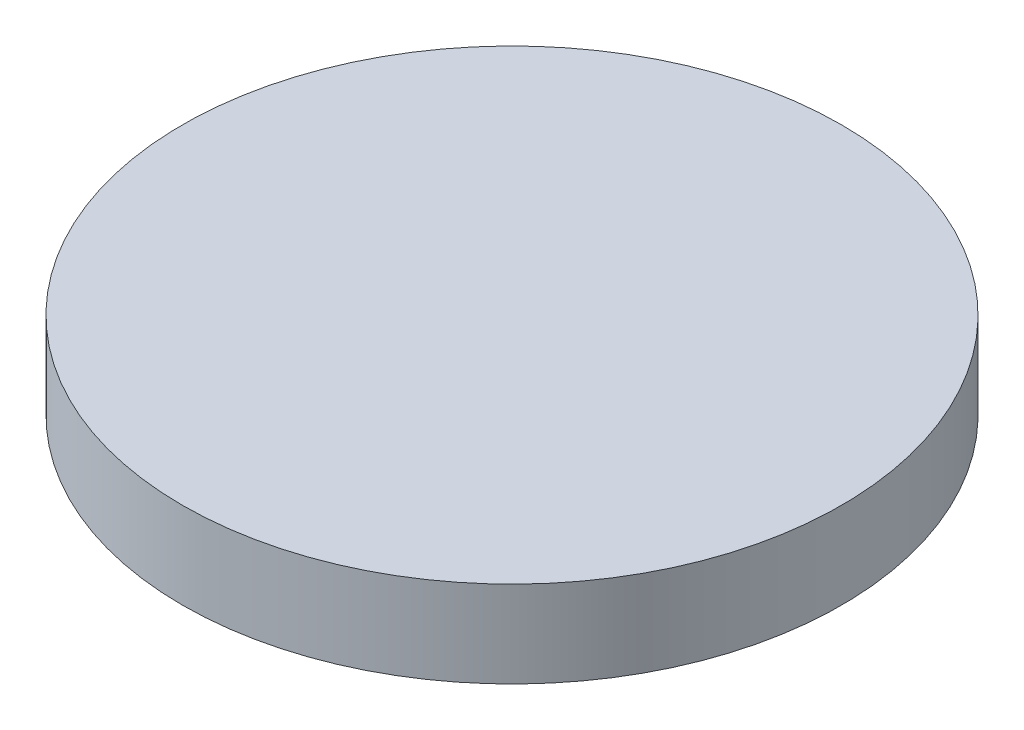
ISO-10303-21;
HEADER;
FILE_DESCRIPTION(('STEP AP214'),'2;1');
FILE_NAME('part.step','',(''),(''),'','','');
FILE_SCHEMA(('AUTOMOTIVE_DESIGN { 1 0 10303 214 1 1 1 1 }'));
ENDSEC;
DATA;
#1=APPLICATION_CONTEXT('core data for automotive mechanical design processes');
#2=APPLICATION_PROTOCOL_DEFINITION('international standard','automotive_design',2000,#1);
#3=PRODUCT_CONTEXT('',#1,'mechanical');
#4=PRODUCT('Part','Part','',(#3));
#5=PRODUCT_RELATED_PRODUCT_CATEGORY('part','',(#4));
#6=PRODUCT_DEFINITION_FORMATION('','',#4);
#7=PRODUCT_DEFINITION_CONTEXT('part definition',#1,'design');
#8=PRODUCT_DEFINITION('design','',#6,#7);
#9=PRODUCT_DEFINITION_SHAPE('','',#8);
#10=(LENGTH_UNIT() NAMED_UNIT(*) SI_UNIT(.MILLI.,.METRE.));
#11=(NAMED_UNIT(*) PLANE_ANGLE_UNIT() SI_UNIT($,.RADIAN.));
#12=(NAMED_UNIT(*) SI_UNIT($,.STERADIAN.) SOLID_ANGLE_UNIT());
#13=UNCERTAINTY_MEASURE_WITH_UNIT(LENGTH_MEASURE(1.E-05),#10,'distance_accuracy_value','');
#14=(GEOMETRIC_REPRESENTATION_CONTEXT(3) GLOBAL_UNCERTAINTY_ASSIGNED_CONTEXT((#13)) GLOBAL_UNIT_ASSIGNED_CONTEXT((#10,
#11,#12)) REPRESENTATION_CONTEXT('',''));
#15=CARTESIAN_POINT('',(0.,0.,0.));
#16=DIRECTION('',(0.,0.,1.));
#17=DIRECTION('',(1.,0.,0.));
#18=AXIS2_PLACEMENT_3D('',#15,#16,#17);
#19=CARTESIAN_POINT('',(0.,20.,0.));
#20=DIRECTION('',(0.,-1.,0.));
#21=DIRECTION('',(0.,0.,-1.));
#22=AXIS2_PLACEMENT_3D('',#19,#20,#21);
#23=CYLINDRICAL_SURFACE('',#22,76.2);
#24=CARTESIAN_POINT('',(0.,20.,0.));
#25=DIRECTION('',(0.,1.,0.));
#26=DIRECTION('',(0.,0.,1.));
#27=AXIS2_PLACEMENT_3D('',#24,#25,#26);
#28=CIRCLE('',#27,76.2);
#29=CARTESIAN_POINT('',(0.,20.,76.2));
#30=VERTEX_POINT('',#29);
#31=EDGE_CURVE('E10',#30,#30,#28,.T.);
#32=ORIENTED_EDGE('',*,*,#31,.F.);
#33=EDGE_LOOP('',(#32));
#34=FACE_BOUND('',#33,.T.);
#35=CARTESIAN_POINT('',(0.,0.,0.));
#36=DIRECTION('',(0.,1.,0.));
#37=DIRECTION('',(0.,0.,1.));
#38=AXIS2_PLACEMENT_3D('',#35,#36,#37);
#39=CIRCLE('',#38,76.2);
#40=CARTESIAN_POINT('',(0.,0.,76.2));
#41=VERTEX_POINT('',#40);
#42=EDGE_CURVE('E42',#41,#41,#39,.T.);
#43=ORIENTED_EDGE('',*,*,#42,.T.);
#44=EDGE_LOOP('',(#43));
#45=FACE_BOUND('',#44,.T.);
#46=ADVANCED_FACE('F39',(#34,#45),#23,.T.);
#47=CARTESIAN_POINT('',(0.,20.,0.));
#48=DIRECTION('',(0.,1.,0.));
#49=DIRECTION('',(0.,0.,1.));
#50=AXIS2_PLACEMENT_3D('',#47,#48,#49);
#51=PLANE('',#50);
#52=ORIENTED_EDGE('',*,*,#31,.T.);
#53=EDGE_LOOP('',(#52));
#54=FACE_BOUND('',#53,.T.);
#55=ADVANCED_FACE('F56',(#54),#51,.T.);
#56=CARTESIAN_POINT('',(0.,0.,0.));
#57=DIRECTION('',(0.,1.,0.));
#58=DIRECTION('',(0.,0.,1.));
#59=AXIS2_PLACEMENT_3D('',#56,#57,#58);
#60=PLANE('',#59);
#61=ORIENTED_EDGE('',*,*,#42,.F.);
#62=EDGE_LOOP('',(#61));
#63=FACE_BOUND('',#62,.T.);
#64=ADVANCED_FACE('F54',(#63),#60,.F.);
#65=CLOSED_SHELL('',(#46,#55,#64));
#66=MANIFOLD_SOLID_BREP('B2',#65);
#67=ADVANCED_BREP_SHAPE_REPRESENTATION('',(#18,#66),#14);
#68=SHAPE_DEFINITION_REPRESENTATION(#9,#67);
ENDSEC;
END-ISO-10303-21;
